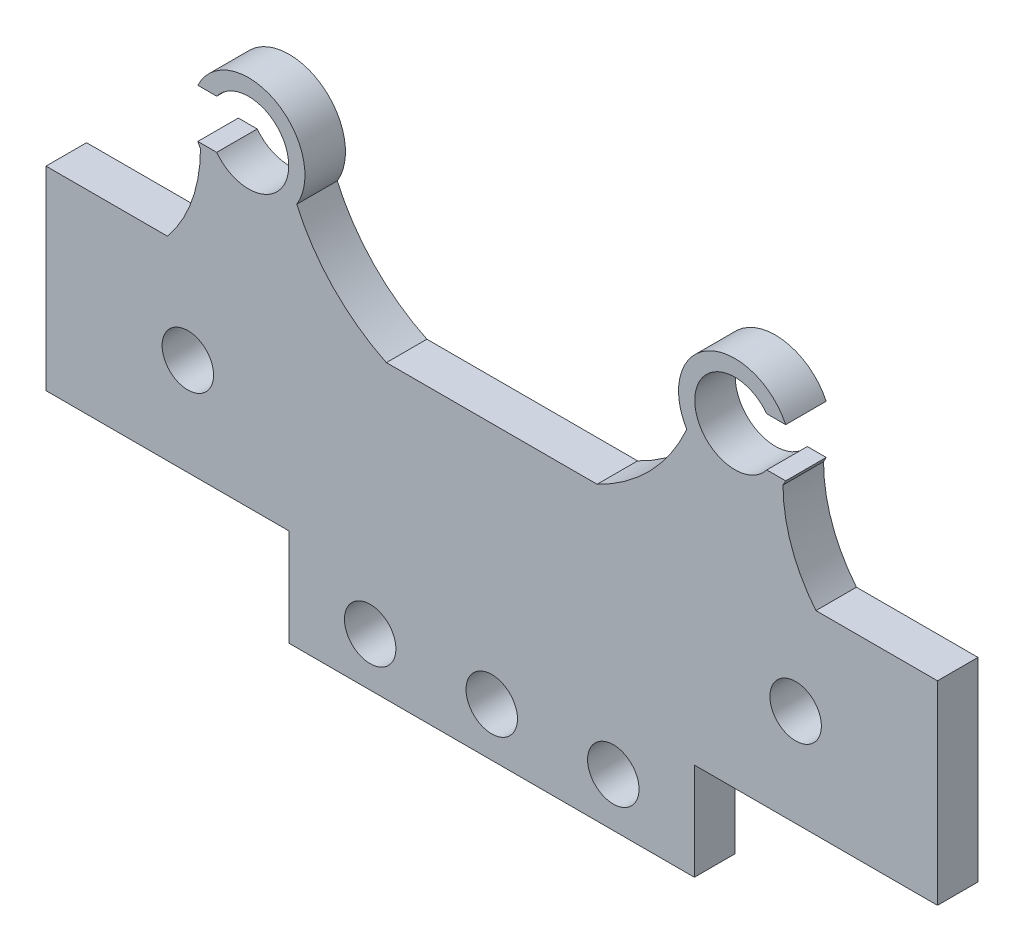
ISO-10303-21;
HEADER;
FILE_DESCRIPTION(('STEP AP214'),'2;1');
FILE_NAME('part.step','',(''),(''),'','','');
FILE_SCHEMA(('AUTOMOTIVE_DESIGN { 1 0 10303 214 1 1 1 1 }'));
ENDSEC;
DATA;
#1=APPLICATION_CONTEXT('core data for automotive mechanical design processes');
#2=APPLICATION_PROTOCOL_DEFINITION('international standard','automotive_design',2000,#1);
#3=PRODUCT_CONTEXT('',#1,'mechanical');
#4=PRODUCT('Part','Part','',(#3));
#5=PRODUCT_RELATED_PRODUCT_CATEGORY('part','',(#4));
#6=PRODUCT_DEFINITION_FORMATION('','',#4);
#7=PRODUCT_DEFINITION_CONTEXT('part definition',#1,'design');
#8=PRODUCT_DEFINITION('design','',#6,#7);
#9=PRODUCT_DEFINITION_SHAPE('','',#8);
#10=(LENGTH_UNIT() NAMED_UNIT(*) SI_UNIT(.MILLI.,.METRE.));
#11=(NAMED_UNIT(*) PLANE_ANGLE_UNIT() SI_UNIT($,.RADIAN.));
#12=(NAMED_UNIT(*) SI_UNIT($,.STERADIAN.) SOLID_ANGLE_UNIT());
#13=UNCERTAINTY_MEASURE_WITH_UNIT(LENGTH_MEASURE(1.E-05),#10,'distance_accuracy_value','');
#14=(GEOMETRIC_REPRESENTATION_CONTEXT(3) GLOBAL_UNCERTAINTY_ASSIGNED_CONTEXT((#13)) GLOBAL_UNIT_ASSIGNED_CONTEXT((#10,
#11,#12)) REPRESENTATION_CONTEXT('',''));
#15=CARTESIAN_POINT('',(0.,0.,0.));
#16=DIRECTION('',(0.,0.,1.));
#17=DIRECTION('',(1.,0.,0.));
#18=AXIS2_PLACEMENT_3D('',#15,#16,#17);
#19=CARTESIAN_POINT('',(53.9385104929325,11.3893777371026,5.));
#20=DIRECTION('',(0.,0.,1.));
#21=DIRECTION('',(1.,0.,0.));
#22=AXIS2_PLACEMENT_3D('',#19,#20,#21);
#23=PLANE('',#22);
#24=CARTESIAN_POINT('',(37.5,-12.,5.));
#25=DIRECTION('',(0.,0.,1.));
#26=DIRECTION('',(-1.,0.,0.));
#27=AXIS2_PLACEMENT_3D('',#24,#25,#26);
#28=CIRCLE('',#27,3.175);
#29=CARTESIAN_POINT('',(34.325,-12.,5.));
#30=VERTEX_POINT('',#29);
#31=EDGE_CURVE('E349',#30,#30,#28,.T.);
#32=ORIENTED_EDGE('',*,*,#31,.F.);
#33=EDGE_LOOP('',(#32));
#34=FACE_BOUND('',#33,.T.);
#35=CARTESIAN_POINT('',(-15.,-30.,5.));
#36=DIRECTION('',(0.,0.,1.));
#37=DIRECTION('',(1.,0.,0.));
#38=AXIS2_PLACEMENT_3D('',#35,#36,#37);
#39=CIRCLE('',#38,3.175);
#40=CARTESIAN_POINT('',(-11.825,-30.,5.));
#41=VERTEX_POINT('',#40);
#42=EDGE_CURVE('E333',#41,#41,#39,.T.);
#43=ORIENTED_EDGE('',*,*,#42,.F.);
#44=EDGE_LOOP('',(#43));
#45=FACE_BOUND('',#44,.T.);
#46=CARTESIAN_POINT('',(-37.5,-12.,5.));
#47=DIRECTION('',(0.,0.,1.));
#48=DIRECTION('',(1.,0.,0.));
#49=AXIS2_PLACEMENT_3D('',#46,#47,#48);
#50=CIRCLE('',#49,3.175);
#51=CARTESIAN_POINT('',(-34.325,-12.,5.));
#52=VERTEX_POINT('',#51);
#53=EDGE_CURVE('E319',#52,#52,#50,.T.);
#54=ORIENTED_EDGE('',*,*,#53,.F.);
#55=EDGE_LOOP('',(#54));
#56=FACE_BOUND('',#55,.T.);
#57=CARTESIAN_POINT('',(0.,-30.,5.));
#58=DIRECTION('',(0.,0.,1.));
#59=DIRECTION('',(1.,0.,0.));
#60=AXIS2_PLACEMENT_3D('',#57,#58,#59);
#61=CIRCLE('',#60,3.175);
#62=CARTESIAN_POINT('',(3.175,-30.,5.));
#63=VERTEX_POINT('',#62);
#64=EDGE_CURVE('E325',#63,#63,#61,.T.);
#65=ORIENTED_EDGE('',*,*,#64,.F.);
#66=EDGE_LOOP('',(#65));
#67=FACE_BOUND('',#66,.T.);
#68=CARTESIAN_POINT('',(15.,-30.,5.));
#69=DIRECTION('',(0.,0.,1.));
#70=DIRECTION('',(-1.,0.,0.));
#71=AXIS2_PLACEMENT_3D('',#68,#69,#70);
#72=CIRCLE('',#71,3.175);
#73=CARTESIAN_POINT('',(11.825,-30.,5.));
#74=VERTEX_POINT('',#73);
#75=EDGE_CURVE('E357',#74,#74,#72,.T.);
#76=ORIENTED_EDGE('',*,*,#75,.F.);
#77=EDGE_LOOP('',(#76));
#78=FACE_BOUND('',#77,.T.);
#79=CARTESIAN_POINT('',(-30.,15.,5.));
#80=DIRECTION('',(0.,0.,1.));
#81=DIRECTION('',(1.,0.,0.));
#82=AXIS2_PLACEMENT_3D('',#79,#80,#81);
#83=CIRCLE('',#82,6.95);
#84=CARTESIAN_POINT('',(-24.0614895070675,11.3893777371027,5.));
#85=VERTEX_POINT('',#84);
#86=CARTESIAN_POINT('',(-36.2691705990506,18.,5.));
#87=VERTEX_POINT('',#86);
#88=EDGE_CURVE('E221',#85,#87,#83,.T.);
#89=ORIENTED_EDGE('',*,*,#88,.T.);
#90=DIRECTION('',(-1.,0.,0.));
#91=VECTOR('',#90,1.);
#92=CARTESIAN_POINT('',(-30.,18.,5.));
#93=LINE('',#92,#91);
#94=CARTESIAN_POINT('',(-33.937321424522,18.,5.));
#95=VERTEX_POINT('',#94);
#96=EDGE_CURVE('E205',#95,#87,#93,.T.);
#97=ORIENTED_EDGE('',*,*,#96,.F.);
#98=CARTESIAN_POINT('',(-30.,15.,5.));
#99=DIRECTION('',(0.,0.,1.));
#100=DIRECTION('',(1.,0.,0.));
#101=AXIS2_PLACEMENT_3D('',#98,#99,#100);
#102=CIRCLE('',#101,4.95);
#103=CARTESIAN_POINT('',(-33.937321424522,12.,5.));
#104=VERTEX_POINT('',#103);
#105=EDGE_CURVE('E308',#104,#95,#102,.T.);
#106=ORIENTED_EDGE('',*,*,#105,.F.);
#107=DIRECTION('',(1.,0.,0.));
#108=VECTOR('',#107,1.);
#109=CARTESIAN_POINT('',(-30.,12.,5.));
#110=LINE('',#109,#108);
#111=CARTESIAN_POINT('',(-36.2691705990506,12.,5.));
#112=VERTEX_POINT('',#111);
#113=EDGE_CURVE('E69',#112,#104,#110,.T.);
#114=ORIENTED_EDGE('',*,*,#113,.F.);
#115=CARTESIAN_POINT('',(-35.9385104929326,11.3893777371026,5.));
#116=VERTEX_POINT('',#115);
#117=EDGE_CURVE('E233',#112,#116,#83,.T.);
#118=ORIENTED_EDGE('',*,*,#117,.T.);
#119=CARTESIAN_POINT('',(-53.9385104929325,11.3893777371026,5.));
#120=DIRECTION('',(0.,0.,-1.));
#121=DIRECTION('',(-1.,0.,0.));
#122=AXIS2_PLACEMENT_3D('',#119,#120,#121);
#123=CIRCLE('',#122,18.);
#124=CARTESIAN_POINT('',(-40.,0.,5.));
#125=VERTEX_POINT('',#124);
#126=EDGE_CURVE('E232',#116,#125,#123,.T.);
#127=ORIENTED_EDGE('',*,*,#126,.T.);
#128=DIRECTION('',(-1.,0.,0.));
#129=VECTOR('',#128,1.);
#130=CARTESIAN_POINT('',(-40.,0.,5.));
#131=LINE('',#130,#129);
#132=CARTESIAN_POINT('',(-55.,0.,5.));
#133=VERTEX_POINT('',#132);
#134=EDGE_CURVE('E257',#125,#133,#131,.T.);
#135=ORIENTED_EDGE('',*,*,#134,.T.);
#136=DIRECTION('',(0.,-1.,0.));
#137=VECTOR('',#136,1.);
#138=CARTESIAN_POINT('',(-55.,0.,5.));
#139=LINE('',#138,#137);
#140=CARTESIAN_POINT('',(-55.,-24.,5.));
#141=VERTEX_POINT('',#140);
#142=EDGE_CURVE('E263',#133,#141,#139,.T.);
#143=ORIENTED_EDGE('',*,*,#142,.T.);
#144=DIRECTION('',(1.,0.,0.));
#145=VECTOR('',#144,1.);
#146=CARTESIAN_POINT('',(-55.,-24.,5.));
#147=LINE('',#146,#145);
#148=CARTESIAN_POINT('',(-25.,-24.,5.));
#149=VERTEX_POINT('',#148);
#150=EDGE_CURVE('E269',#141,#149,#147,.T.);
#151=ORIENTED_EDGE('',*,*,#150,.T.);
#152=DIRECTION('',(0.,-1.,0.));
#153=VECTOR('',#152,1.);
#154=CARTESIAN_POINT('',(-25.,-24.,5.));
#155=LINE('',#154,#153);
#156=CARTESIAN_POINT('',(-25.,-36.,5.));
#157=VERTEX_POINT('',#156);
#158=EDGE_CURVE('E273',#149,#157,#155,.T.);
#159=ORIENTED_EDGE('',*,*,#158,.T.);
#160=DIRECTION('',(1.,0.,0.));
#161=VECTOR('',#160,1.);
#162=CARTESIAN_POINT('',(-25.,-36.,5.));
#163=LINE('',#162,#161);
#164=CARTESIAN_POINT('',(25.,-36.,5.));
#165=VERTEX_POINT('',#164);
#166=EDGE_CURVE('E438',#157,#165,#163,.T.);
#167=ORIENTED_EDGE('',*,*,#166,.T.);
#168=DIRECTION('',(0.,1.,0.));
#169=VECTOR('',#168,1.);
#170=CARTESIAN_POINT('',(25.,-24.,5.));
#171=LINE('',#170,#169);
#172=CARTESIAN_POINT('',(25.,-24.,5.));
#173=VERTEX_POINT('',#172);
#174=EDGE_CURVE('E442',#165,#173,#171,.T.);
#175=ORIENTED_EDGE('',*,*,#174,.T.);
#176=DIRECTION('',(1.,0.,0.));
#177=VECTOR('',#176,1.);
#178=CARTESIAN_POINT('',(55.,-24.,5.));
#179=LINE('',#178,#177);
#180=CARTESIAN_POINT('',(55.,-24.,5.));
#181=VERTEX_POINT('',#180);
#182=EDGE_CURVE('E446',#173,#181,#179,.T.);
#183=ORIENTED_EDGE('',*,*,#182,.T.);
#184=DIRECTION('',(0.,1.,0.));
#185=VECTOR('',#184,1.);
#186=CARTESIAN_POINT('',(55.,0.,5.));
#187=LINE('',#186,#185);
#188=CARTESIAN_POINT('',(55.,0.,5.));
#189=VERTEX_POINT('',#188);
#190=EDGE_CURVE('E452',#181,#189,#187,.T.);
#191=ORIENTED_EDGE('',*,*,#190,.T.);
#192=DIRECTION('',(-1.,0.,0.));
#193=VECTOR('',#192,1.);
#194=CARTESIAN_POINT('',(40.,0.,5.));
#195=LINE('',#194,#193);
#196=CARTESIAN_POINT('',(40.,0.,5.));
#197=VERTEX_POINT('',#196);
#198=EDGE_CURVE('E531',#189,#197,#195,.T.);
#199=ORIENTED_EDGE('',*,*,#198,.T.);
#200=CARTESIAN_POINT('',(53.9385104929325,11.3893777371026,5.));
#201=DIRECTION('',(0.,0.,-1.));
#202=DIRECTION('',(1.,0.,0.));
#203=AXIS2_PLACEMENT_3D('',#200,#201,#202);
#204=CIRCLE('',#203,18.);
#205=CARTESIAN_POINT('',(35.9385104929326,11.3893777371026,5.));
#206=VERTEX_POINT('',#205);
#207=EDGE_CURVE('E527',#197,#206,#204,.T.);
#208=ORIENTED_EDGE('',*,*,#207,.T.);
#209=CARTESIAN_POINT('',(30.,15.,5.));
#210=DIRECTION('',(0.,0.,1.));
#211=DIRECTION('',(-1.,0.,0.));
#212=AXIS2_PLACEMENT_3D('',#209,#210,#211);
#213=CIRCLE('',#212,6.95);
#214=CARTESIAN_POINT('',(36.2691705990506,12.,5.));
#215=VERTEX_POINT('',#214);
#216=EDGE_CURVE('E522',#206,#215,#213,.T.);
#217=ORIENTED_EDGE('',*,*,#216,.T.);
#218=DIRECTION('',(1.,0.,0.));
#219=VECTOR('',#218,1.);
#220=CARTESIAN_POINT('',(30.,12.,5.));
#221=LINE('',#220,#219);
#222=CARTESIAN_POINT('',(33.937321424522,12.,5.));
#223=VERTEX_POINT('',#222);
#224=EDGE_CURVE('E374',#223,#215,#221,.T.);
#225=ORIENTED_EDGE('',*,*,#224,.F.);
#226=CARTESIAN_POINT('',(30.,15.,5.));
#227=DIRECTION('',(0.,0.,1.));
#228=DIRECTION('',(-1.,0.,0.));
#229=AXIS2_PLACEMENT_3D('',#226,#227,#228);
#230=CIRCLE('',#229,4.95);
#231=CARTESIAN_POINT('',(33.937321424522,18.,5.));
#232=VERTEX_POINT('',#231);
#233=EDGE_CURVE('E341',#232,#223,#230,.T.);
#234=ORIENTED_EDGE('',*,*,#233,.F.);
#235=DIRECTION('',(-1.,0.,0.));
#236=VECTOR('',#235,1.);
#237=CARTESIAN_POINT('',(30.,18.,5.));
#238=LINE('',#237,#236);
#239=CARTESIAN_POINT('',(36.2691705990506,18.,5.));
#240=VERTEX_POINT('',#239);
#241=EDGE_CURVE('E379',#240,#232,#238,.T.);
#242=ORIENTED_EDGE('',*,*,#241,.F.);
#243=CARTESIAN_POINT('',(24.0614895070675,11.3893777371026,5.));
#244=VERTEX_POINT('',#243);
#245=EDGE_CURVE('E526',#240,#244,#213,.T.);
#246=ORIENTED_EDGE('',*,*,#245,.T.);
#247=CARTESIAN_POINT('',(3.04543692353487,20.7341909404895,5.));
#248=DIRECTION('',(0.,0.,-1.));
#249=DIRECTION('',(-1.,0.,0.));
#250=AXIS2_PLACEMENT_3D('',#247,#248,#249);
#251=CIRCLE('',#250,23.);
#252=CARTESIAN_POINT('',(13.,0.,5.));
#253=VERTEX_POINT('',#252);
#254=EDGE_CURVE('E518',#244,#253,#251,.T.);
#255=ORIENTED_EDGE('',*,*,#254,.T.);
#256=DIRECTION('',(-1.,0.,0.));
#257=VECTOR('',#256,1.);
#258=CARTESIAN_POINT('',(13.,0.,5.));
#259=LINE('',#258,#257);
#260=CARTESIAN_POINT('',(-13.,0.,5.));
#261=VERTEX_POINT('',#260);
#262=EDGE_CURVE('E515',#253,#261,#259,.T.);
#263=ORIENTED_EDGE('',*,*,#262,.T.);
#264=CARTESIAN_POINT('',(-3.04543692353487,20.7341909404895,5.));
#265=DIRECTION('',(0.,0.,-1.));
#266=DIRECTION('',(1.,0.,0.));
#267=AXIS2_PLACEMENT_3D('',#264,#265,#266);
#268=CIRCLE('',#267,23.);
#269=EDGE_CURVE('E229',#261,#85,#268,.T.);
#270=ORIENTED_EDGE('',*,*,#269,.T.);
#271=EDGE_LOOP('',(#89,#97,#106,#114,#118,#127,#135,#143,#151,#159,#167,#175,#183,#191,#199,
#208,#217,#225,#234,#242,#246,#255,#263,#270));
#272=FACE_BOUND('',#271,.T.);
#273=ADVANCED_FACE('F46',(#34,#45,#56,#67,#78,#272),#23,.T.);
#274=CARTESIAN_POINT('',(53.9385104929325,11.3893777371026,0.));
#275=DIRECTION('',(0.,0.,1.));
#276=DIRECTION('',(1.,0.,0.));
#277=AXIS2_PLACEMENT_3D('',#274,#275,#276);
#278=PLANE('',#277);
#279=CARTESIAN_POINT('',(-37.5,-12.,0.));
#280=DIRECTION('',(0.,0.,1.));
#281=DIRECTION('',(1.,0.,0.));
#282=AXIS2_PLACEMENT_3D('',#279,#280,#281);
#283=CIRCLE('',#282,3.175);
#284=CARTESIAN_POINT('',(-34.325,-12.,0.));
#285=VERTEX_POINT('',#284);
#286=EDGE_CURVE('E321',#285,#285,#283,.T.);
#287=ORIENTED_EDGE('',*,*,#286,.T.);
#288=EDGE_LOOP('',(#287));
#289=FACE_BOUND('',#288,.T.);
#290=CARTESIAN_POINT('',(0.,-30.,0.));
#291=DIRECTION('',(0.,0.,1.));
#292=DIRECTION('',(1.,0.,0.));
#293=AXIS2_PLACEMENT_3D('',#290,#291,#292);
#294=CIRCLE('',#293,3.175);
#295=CARTESIAN_POINT('',(3.175,-30.,0.));
#296=VERTEX_POINT('',#295);
#297=EDGE_CURVE('E329',#296,#296,#294,.T.);
#298=ORIENTED_EDGE('',*,*,#297,.T.);
#299=EDGE_LOOP('',(#298));
#300=FACE_BOUND('',#299,.T.);
#301=CARTESIAN_POINT('',(-15.,-30.,0.));
#302=DIRECTION('',(0.,0.,1.));
#303=DIRECTION('',(1.,0.,0.));
#304=AXIS2_PLACEMENT_3D('',#301,#302,#303);
#305=CIRCLE('',#304,3.175);
#306=CARTESIAN_POINT('',(-11.825,-30.,0.));
#307=VERTEX_POINT('',#306);
#308=EDGE_CURVE('E337',#307,#307,#305,.T.);
#309=ORIENTED_EDGE('',*,*,#308,.T.);
#310=EDGE_LOOP('',(#309));
#311=FACE_BOUND('',#310,.T.);
#312=CARTESIAN_POINT('',(37.5,-12.,0.));
#313=DIRECTION('',(0.,0.,1.));
#314=DIRECTION('',(-1.,0.,0.));
#315=AXIS2_PLACEMENT_3D('',#312,#313,#314);
#316=CIRCLE('',#315,3.175);
#317=CARTESIAN_POINT('',(34.325,-12.,0.));
#318=VERTEX_POINT('',#317);
#319=EDGE_CURVE('E353',#318,#318,#316,.T.);
#320=ORIENTED_EDGE('',*,*,#319,.T.);
#321=EDGE_LOOP('',(#320));
#322=FACE_BOUND('',#321,.T.);
#323=CARTESIAN_POINT('',(15.,-30.,0.));
#324=DIRECTION('',(0.,0.,1.));
#325=DIRECTION('',(-1.,0.,0.));
#326=AXIS2_PLACEMENT_3D('',#323,#324,#325);
#327=CIRCLE('',#326,3.175);
#328=CARTESIAN_POINT('',(11.825,-30.,0.));
#329=VERTEX_POINT('',#328);
#330=EDGE_CURVE('E225',#329,#329,#327,.T.);
#331=ORIENTED_EDGE('',*,*,#330,.T.);
#332=EDGE_LOOP('',(#331));
#333=FACE_BOUND('',#332,.T.);
#334=DIRECTION('',(-1.,0.,0.));
#335=VECTOR('',#334,1.);
#336=CARTESIAN_POINT('',(-30.,18.,0.));
#337=LINE('',#336,#335);
#338=CARTESIAN_POINT('',(-33.937321424522,18.,0.));
#339=VERTEX_POINT('',#338);
#340=CARTESIAN_POINT('',(-36.2691705990506,18.,0.));
#341=VERTEX_POINT('',#340);
#342=EDGE_CURVE('E62',#339,#341,#337,.T.);
#343=ORIENTED_EDGE('',*,*,#342,.T.);
#344=CARTESIAN_POINT('',(-30.,15.,0.));
#345=DIRECTION('',(0.,0.,1.));
#346=DIRECTION('',(1.,0.,0.));
#347=AXIS2_PLACEMENT_3D('',#344,#345,#346);
#348=CIRCLE('',#347,6.95);
#349=CARTESIAN_POINT('',(-24.0614895070675,11.3893777371027,0.));
#350=VERTEX_POINT('',#349);
#351=EDGE_CURVE('E223',#350,#341,#348,.T.);
#352=ORIENTED_EDGE('',*,*,#351,.F.);
#353=CARTESIAN_POINT('',(-3.04543692353487,20.7341909404895,0.));
#354=DIRECTION('',(0.,0.,-1.));
#355=DIRECTION('',(1.,0.,0.));
#356=AXIS2_PLACEMENT_3D('',#353,#354,#355);
#357=CIRCLE('',#356,23.);
#358=CARTESIAN_POINT('',(-13.,0.,0.));
#359=VERTEX_POINT('',#358);
#360=EDGE_CURVE('E690',#359,#350,#357,.T.);
#361=ORIENTED_EDGE('',*,*,#360,.F.);
#362=DIRECTION('',(-1.,0.,0.));
#363=VECTOR('',#362,1.);
#364=CARTESIAN_POINT('',(13.,0.,0.));
#365=LINE('',#364,#363);
#366=CARTESIAN_POINT('',(13.,0.,0.));
#367=VERTEX_POINT('',#366);
#368=EDGE_CURVE('E509',#367,#359,#365,.T.);
#369=ORIENTED_EDGE('',*,*,#368,.F.);
#370=CARTESIAN_POINT('',(3.04543692353487,20.7341909404895,0.));
#371=DIRECTION('',(0.,0.,-1.));
#372=DIRECTION('',(-1.,0.,0.));
#373=AXIS2_PLACEMENT_3D('',#370,#371,#372);
#374=CIRCLE('',#373,23.);
#375=CARTESIAN_POINT('',(24.0614895070675,11.3893777371026,0.));
#376=VERTEX_POINT('',#375);
#377=EDGE_CURVE('E504',#376,#367,#374,.T.);
#378=ORIENTED_EDGE('',*,*,#377,.F.);
#379=CARTESIAN_POINT('',(30.,15.,0.));
#380=DIRECTION('',(0.,0.,1.));
#381=DIRECTION('',(-1.,0.,0.));
#382=AXIS2_PLACEMENT_3D('',#379,#380,#381);
#383=CIRCLE('',#382,6.95);
#384=CARTESIAN_POINT('',(36.2691705990506,18.,0.));
#385=VERTEX_POINT('',#384);
#386=EDGE_CURVE('E505',#385,#376,#383,.T.);
#387=ORIENTED_EDGE('',*,*,#386,.F.);
#388=DIRECTION('',(-1.,0.,0.));
#389=VECTOR('',#388,1.);
#390=CARTESIAN_POINT('',(30.,18.,0.));
#391=LINE('',#390,#389);
#392=CARTESIAN_POINT('',(33.937321424522,18.,0.));
#393=VERTEX_POINT('',#392);
#394=EDGE_CURVE('E380',#385,#393,#391,.T.);
#395=ORIENTED_EDGE('',*,*,#394,.T.);
#396=CARTESIAN_POINT('',(30.,15.,0.));
#397=DIRECTION('',(0.,0.,1.));
#398=DIRECTION('',(-1.,0.,0.));
#399=AXIS2_PLACEMENT_3D('',#396,#397,#398);
#400=CIRCLE('',#399,4.95);
#401=CARTESIAN_POINT('',(33.937321424522,12.,0.));
#402=VERTEX_POINT('',#401);
#403=EDGE_CURVE('E345',#393,#402,#400,.T.);
#404=ORIENTED_EDGE('',*,*,#403,.T.);
#405=DIRECTION('',(1.,0.,0.));
#406=VECTOR('',#405,1.);
#407=CARTESIAN_POINT('',(30.,12.,0.));
#408=LINE('',#407,#406);
#409=CARTESIAN_POINT('',(36.2691705990506,12.,0.));
#410=VERTEX_POINT('',#409);
#411=EDGE_CURVE('E375',#402,#410,#408,.T.);
#412=ORIENTED_EDGE('',*,*,#411,.T.);
#413=CARTESIAN_POINT('',(35.9385104929326,11.3893777371026,0.));
#414=VERTEX_POINT('',#413);
#415=EDGE_CURVE('E499',#414,#410,#383,.T.);
#416=ORIENTED_EDGE('',*,*,#415,.F.);
#417=CARTESIAN_POINT('',(53.9385104929325,11.3893777371026,0.));
#418=DIRECTION('',(0.,0.,-1.));
#419=DIRECTION('',(1.,0.,0.));
#420=AXIS2_PLACEMENT_3D('',#417,#418,#419);
#421=CIRCLE('',#420,18.);
#422=CARTESIAN_POINT('',(40.,0.,0.));
#423=VERTEX_POINT('',#422);
#424=EDGE_CURVE('E489',#423,#414,#421,.T.);
#425=ORIENTED_EDGE('',*,*,#424,.F.);
#426=DIRECTION('',(-1.,0.,0.));
#427=VECTOR('',#426,1.);
#428=CARTESIAN_POINT('',(40.,0.,0.));
#429=LINE('',#428,#427);
#430=CARTESIAN_POINT('',(55.,0.,0.));
#431=VERTEX_POINT('',#430);
#432=EDGE_CURVE('E485',#431,#423,#429,.T.);
#433=ORIENTED_EDGE('',*,*,#432,.F.);
#434=DIRECTION('',(0.,1.,0.));
#435=VECTOR('',#434,1.);
#436=CARTESIAN_POINT('',(55.,0.,0.));
#437=LINE('',#436,#435);
#438=CARTESIAN_POINT('',(55.,-24.,0.));
#439=VERTEX_POINT('',#438);
#440=EDGE_CURVE('E479',#439,#431,#437,.T.);
#441=ORIENTED_EDGE('',*,*,#440,.F.);
#442=DIRECTION('',(1.,0.,0.));
#443=VECTOR('',#442,1.);
#444=CARTESIAN_POINT('',(55.,-24.,0.));
#445=LINE('',#444,#443);
#446=CARTESIAN_POINT('',(25.,-24.,0.));
#447=VERTEX_POINT('',#446);
#448=EDGE_CURVE('E475',#447,#439,#445,.T.);
#449=ORIENTED_EDGE('',*,*,#448,.F.);
#450=DIRECTION('',(0.,1.,0.));
#451=VECTOR('',#450,1.);
#452=CARTESIAN_POINT('',(25.,-24.,0.));
#453=LINE('',#452,#451);
#454=CARTESIAN_POINT('',(25.,-36.,0.));
#455=VERTEX_POINT('',#454);
#456=EDGE_CURVE('E480',#455,#447,#453,.T.);
#457=ORIENTED_EDGE('',*,*,#456,.F.);
#458=DIRECTION('',(1.,0.,0.));
#459=VECTOR('',#458,1.);
#460=CARTESIAN_POINT('',(-25.,-36.,0.));
#461=LINE('',#460,#459);
#462=CARTESIAN_POINT('',(-25.,-36.,0.));
#463=VERTEX_POINT('',#462);
#464=EDGE_CURVE('E970',#463,#455,#461,.T.);
#465=ORIENTED_EDGE('',*,*,#464,.F.);
#466=DIRECTION('',(0.,-1.,0.));
#467=VECTOR('',#466,1.);
#468=CARTESIAN_POINT('',(-25.,-24.,0.));
#469=LINE('',#468,#467);
#470=CARTESIAN_POINT('',(-25.,-24.,0.));
#471=VERTEX_POINT('',#470);
#472=EDGE_CURVE('E971',#471,#463,#469,.T.);
#473=ORIENTED_EDGE('',*,*,#472,.F.);
#474=DIRECTION('',(1.,0.,0.));
#475=VECTOR('',#474,1.);
#476=CARTESIAN_POINT('',(-55.,-24.,0.));
#477=LINE('',#476,#475);
#478=CARTESIAN_POINT('',(-55.,-24.,0.));
#479=VERTEX_POINT('',#478);
#480=EDGE_CURVE('E429',#479,#471,#477,.T.);
#481=ORIENTED_EDGE('',*,*,#480,.F.);
#482=DIRECTION('',(0.,-1.,0.));
#483=VECTOR('',#482,1.);
#484=CARTESIAN_POINT('',(-55.,0.,0.));
#485=LINE('',#484,#483);
#486=CARTESIAN_POINT('',(-55.,0.,0.));
#487=VERTEX_POINT('',#486);
#488=EDGE_CURVE('E318',#487,#479,#485,.T.);
#489=ORIENTED_EDGE('',*,*,#488,.F.);
#490=DIRECTION('',(-1.,0.,0.));
#491=VECTOR('',#490,1.);
#492=CARTESIAN_POINT('',(-40.,0.,0.));
#493=LINE('',#492,#491);
#494=CARTESIAN_POINT('',(-40.,0.,0.));
#495=VERTEX_POINT('',#494);
#496=EDGE_CURVE('E313',#495,#487,#493,.T.);
#497=ORIENTED_EDGE('',*,*,#496,.F.);
#498=CARTESIAN_POINT('',(-53.9385104929325,11.3893777371026,0.));
#499=DIRECTION('',(0.,0.,-1.));
#500=DIRECTION('',(-1.,0.,0.));
#501=AXIS2_PLACEMENT_3D('',#498,#499,#500);
#502=CIRCLE('',#501,18.);
#503=CARTESIAN_POINT('',(-35.9385104929326,11.3893777371026,0.));
#504=VERTEX_POINT('',#503);
#505=EDGE_CURVE('E264',#504,#495,#502,.T.);
#506=ORIENTED_EDGE('',*,*,#505,.F.);
#507=CARTESIAN_POINT('',(-36.2691705990506,12.,0.));
#508=VERTEX_POINT('',#507);
#509=EDGE_CURVE('E401',#508,#504,#348,.T.);
#510=ORIENTED_EDGE('',*,*,#509,.F.);
#511=DIRECTION('',(1.,0.,0.));
#512=VECTOR('',#511,1.);
#513=CARTESIAN_POINT('',(-30.,12.,0.));
#514=LINE('',#513,#512);
#515=CARTESIAN_POINT('',(-33.937321424522,12.,0.));
#516=VERTEX_POINT('',#515);
#517=EDGE_CURVE('E214',#508,#516,#514,.T.);
#518=ORIENTED_EDGE('',*,*,#517,.T.);
#519=CARTESIAN_POINT('',(-30.,15.,0.));
#520=DIRECTION('',(0.,0.,1.));
#521=DIRECTION('',(1.,0.,0.));
#522=AXIS2_PLACEMENT_3D('',#519,#520,#521);
#523=CIRCLE('',#522,4.95);
#524=EDGE_CURVE('E265',#516,#339,#523,.T.);
#525=ORIENTED_EDGE('',*,*,#524,.T.);
#526=EDGE_LOOP('',(#343,#352,#361,#369,#378,#387,#395,#404,#412,#416,#425,#433,#441,#449,#457,
#465,#473,#481,#489,#497,#506,#510,#518,#525));
#527=FACE_BOUND('',#526,.T.);
#528=ADVANCED_FACE('F397',(#289,#300,#311,#322,#333,#527),#278,.F.);
#529=CARTESIAN_POINT('',(30.,15.,5.));
#530=DIRECTION('',(0.,0.,-1.));
#531=DIRECTION('',(-1.,0.,0.));
#532=AXIS2_PLACEMENT_3D('',#529,#530,#531);
#533=CYLINDRICAL_SURFACE('',#532,6.95);
#534=DIRECTION('',(0.,0.,-1.));
#535=VECTOR('',#534,1.);
#536=CARTESIAN_POINT('',(36.2691705990506,18.,5.));
#537=LINE('',#536,#535);
#538=EDGE_CURVE('E370',#240,#385,#537,.T.);
#539=ORIENTED_EDGE('',*,*,#538,.T.);
#540=ORIENTED_EDGE('',*,*,#386,.T.);
#541=DIRECTION('',(0.,0.,-1.));
#542=VECTOR('',#541,1.);
#543=CARTESIAN_POINT('',(24.0614895070675,11.3893777371026,5.));
#544=LINE('',#543,#542);
#545=EDGE_CURVE('E583',#244,#376,#544,.T.);
#546=ORIENTED_EDGE('',*,*,#545,.F.);
#547=ORIENTED_EDGE('',*,*,#245,.F.);
#548=EDGE_LOOP('',(#539,#540,#546,#547));
#549=FACE_BOUND('',#548,.T.);
#550=ADVANCED_FACE('F581',(#549),#533,.T.);
#551=DIRECTION('',(0.,0.,-1.));
#552=VECTOR('',#551,1.);
#553=CARTESIAN_POINT('',(36.2691705990506,12.,5.));
#554=LINE('',#553,#552);
#555=EDGE_CURVE('E367',#215,#410,#554,.T.);
#556=ORIENTED_EDGE('',*,*,#555,.F.);
#557=ORIENTED_EDGE('',*,*,#216,.F.);
#558=DIRECTION('',(0.,0.,-1.));
#559=VECTOR('',#558,1.);
#560=CARTESIAN_POINT('',(35.9385104929326,11.3893777371026,5.));
#561=LINE('',#560,#559);
#562=EDGE_CURVE('E558',#206,#414,#561,.T.);
#563=ORIENTED_EDGE('',*,*,#562,.T.);
#564=ORIENTED_EDGE('',*,*,#415,.T.);
#565=EDGE_LOOP('',(#556,#557,#563,#564));
#566=FACE_BOUND('',#565,.T.);
#567=ADVANCED_FACE('F568',(#566),#533,.T.);
#568=CARTESIAN_POINT('',(-30.,15.,5.));
#569=DIRECTION('',(0.,0.,-1.));
#570=DIRECTION('',(-1.,0.,0.));
#571=AXIS2_PLACEMENT_3D('',#568,#569,#570);
#572=CYLINDRICAL_SURFACE('',#571,6.95);
#573=DIRECTION('',(0.,0.,-1.));
#574=VECTOR('',#573,1.);
#575=CARTESIAN_POINT('',(-36.2691705990506,18.,5.));
#576=LINE('',#575,#574);
#577=EDGE_CURVE('E208',#87,#341,#576,.T.);
#578=ORIENTED_EDGE('',*,*,#577,.F.);
#579=ORIENTED_EDGE('',*,*,#88,.F.);
#580=DIRECTION('',(0.,0.,-1.));
#581=VECTOR('',#580,1.);
#582=CARTESIAN_POINT('',(-24.0614895070675,11.3893777371027,5.));
#583=LINE('',#582,#581);
#584=EDGE_CURVE('E602',#85,#350,#583,.T.);
#585=ORIENTED_EDGE('',*,*,#584,.T.);
#586=ORIENTED_EDGE('',*,*,#351,.T.);
#587=EDGE_LOOP('',(#578,#579,#585,#586));
#588=FACE_BOUND('',#587,.T.);
#589=ADVANCED_FACE('F219',(#588),#572,.T.);
#590=DIRECTION('',(0.,0.,-1.));
#591=VECTOR('',#590,1.);
#592=CARTESIAN_POINT('',(-36.2691705990506,12.,5.));
#593=LINE('',#592,#591);
#594=EDGE_CURVE('E226',#112,#508,#593,.T.);
#595=ORIENTED_EDGE('',*,*,#594,.T.);
#596=ORIENTED_EDGE('',*,*,#509,.T.);
#597=DIRECTION('',(0.,0.,-1.));
#598=VECTOR('',#597,1.);
#599=CARTESIAN_POINT('',(-35.9385104929326,11.3893777371026,5.));
#600=LINE('',#599,#598);
#601=EDGE_CURVE('E407',#116,#504,#600,.T.);
#602=ORIENTED_EDGE('',*,*,#601,.F.);
#603=ORIENTED_EDGE('',*,*,#117,.F.);
#604=EDGE_LOOP('',(#595,#596,#602,#603));
#605=FACE_BOUND('',#604,.T.);
#606=ADVANCED_FACE('F404',(#605),#572,.T.);
#607=CARTESIAN_POINT('',(-30.,15.,5.));
#608=DIRECTION('',(0.,0.,-1.));
#609=DIRECTION('',(-1.,0.,0.));
#610=AXIS2_PLACEMENT_3D('',#607,#608,#609);
#611=CYLINDRICAL_SURFACE('',#610,4.95);
#612=ORIENTED_EDGE('',*,*,#105,.T.);
#613=DIRECTION('',(0.,0.,-1.));
#614=VECTOR('',#613,1.);
#615=CARTESIAN_POINT('',(-33.937321424522,18.,5.));
#616=LINE('',#615,#614);
#617=EDGE_CURVE('E12',#95,#339,#616,.T.);
#618=ORIENTED_EDGE('',*,*,#617,.T.);
#619=ORIENTED_EDGE('',*,*,#524,.F.);
#620=DIRECTION('',(0.,0.,-1.));
#621=VECTOR('',#620,1.);
#622=CARTESIAN_POINT('',(-33.937321424522,12.,5.));
#623=LINE('',#622,#621);
#624=EDGE_CURVE('E55',#516,#104,#623,.F.);
#625=ORIENTED_EDGE('',*,*,#624,.T.);
#626=EDGE_LOOP('',(#612,#618,#619,#625));
#627=FACE_BOUND('',#626,.T.);
#628=ADVANCED_FACE('F307',(#627),#611,.F.);
#629=CARTESIAN_POINT('',(30.,15.,5.));
#630=DIRECTION('',(0.,0.,-1.));
#631=DIRECTION('',(-1.,0.,0.));
#632=AXIS2_PLACEMENT_3D('',#629,#630,#631);
#633=CYLINDRICAL_SURFACE('',#632,4.95);
#634=ORIENTED_EDGE('',*,*,#403,.F.);
#635=DIRECTION('',(0.,0.,-1.));
#636=VECTOR('',#635,1.);
#637=CARTESIAN_POINT('',(33.937321424522,18.,5.));
#638=LINE('',#637,#636);
#639=EDGE_CURVE('E301',#393,#232,#638,.F.);
#640=ORIENTED_EDGE('',*,*,#639,.T.);
#641=ORIENTED_EDGE('',*,*,#233,.T.);
#642=DIRECTION('',(0.,0.,-1.));
#643=VECTOR('',#642,1.);
#644=CARTESIAN_POINT('',(33.937321424522,12.,5.));
#645=LINE('',#644,#643);
#646=EDGE_CURVE('E297',#223,#402,#645,.T.);
#647=ORIENTED_EDGE('',*,*,#646,.T.);
#648=EDGE_LOOP('',(#634,#640,#641,#647));
#649=FACE_BOUND('',#648,.T.);
#650=ADVANCED_FACE('F575',(#649),#633,.F.);
#651=CARTESIAN_POINT('',(-40.,0.,5.));
#652=DIRECTION('',(0.,-1.,0.));
#653=DIRECTION('',(1.,0.,0.));
#654=AXIS2_PLACEMENT_3D('',#651,#652,#653);
#655=PLANE('',#654);
#656=ORIENTED_EDGE('',*,*,#496,.T.);
#657=DIRECTION('',(0.,0.,-1.));
#658=VECTOR('',#657,1.);
#659=CARTESIAN_POINT('',(-55.,0.,5.));
#660=LINE('',#659,#658);
#661=EDGE_CURVE('E290',#133,#487,#660,.T.);
#662=ORIENTED_EDGE('',*,*,#661,.F.);
#663=ORIENTED_EDGE('',*,*,#134,.F.);
#664=DIRECTION('',(0.,0.,-1.));
#665=VECTOR('',#664,1.);
#666=CARTESIAN_POINT('',(-40.,0.,5.));
#667=LINE('',#666,#665);
#668=EDGE_CURVE('E238',#125,#495,#667,.T.);
#669=ORIENTED_EDGE('',*,*,#668,.T.);
#670=EDGE_LOOP('',(#656,#662,#663,#669));
#671=FACE_BOUND('',#670,.T.);
#672=ADVANCED_FACE('F48',(#671),#655,.F.);
#673=CARTESIAN_POINT('',(-55.,0.,5.));
#674=DIRECTION('',(1.,0.,0.));
#675=DIRECTION('',(0.,0.,-1.));
#676=AXIS2_PLACEMENT_3D('',#673,#674,#675);
#677=PLANE('',#676);
#678=ORIENTED_EDGE('',*,*,#488,.T.);
#679=DIRECTION('',(0.,0.,-1.));
#680=VECTOR('',#679,1.);
#681=CARTESIAN_POINT('',(-55.,-24.,5.));
#682=LINE('',#681,#680);
#683=EDGE_CURVE('E285',#141,#479,#682,.T.);
#684=ORIENTED_EDGE('',*,*,#683,.F.);
#685=ORIENTED_EDGE('',*,*,#142,.F.);
#686=ORIENTED_EDGE('',*,*,#661,.T.);
#687=EDGE_LOOP('',(#678,#684,#685,#686));
#688=FACE_BOUND('',#687,.T.);
#689=ADVANCED_FACE('F419',(#688),#677,.F.);
#690=CARTESIAN_POINT('',(-55.,-24.,5.));
#691=DIRECTION('',(0.,1.,0.));
#692=DIRECTION('',(0.,0.,1.));
#693=AXIS2_PLACEMENT_3D('',#690,#691,#692);
#694=PLANE('',#693);
#695=ORIENTED_EDGE('',*,*,#480,.T.);
#696=DIRECTION('',(0.,0.,-1.));
#697=VECTOR('',#696,1.);
#698=CARTESIAN_POINT('',(-25.,-24.,5.));
#699=LINE('',#698,#697);
#700=EDGE_CURVE('E291',#149,#471,#699,.T.);
#701=ORIENTED_EDGE('',*,*,#700,.F.);
#702=ORIENTED_EDGE('',*,*,#150,.F.);
#703=ORIENTED_EDGE('',*,*,#683,.T.);
#704=EDGE_LOOP('',(#695,#701,#702,#703));
#705=FACE_BOUND('',#704,.T.);
#706=ADVANCED_FACE('F427',(#705),#694,.F.);
#707=CARTESIAN_POINT('',(-25.,-24.,5.));
#708=DIRECTION('',(1.,0.,0.));
#709=DIRECTION('',(0.,0.,-1.));
#710=AXIS2_PLACEMENT_3D('',#707,#708,#709);
#711=PLANE('',#710);
#712=ORIENTED_EDGE('',*,*,#472,.T.);
#713=DIRECTION('',(0.,0.,-1.));
#714=VECTOR('',#713,1.);
#715=CARTESIAN_POINT('',(-25.,-36.,5.));
#716=LINE('',#715,#714);
#717=EDGE_CURVE('E433',#157,#463,#716,.T.);
#718=ORIENTED_EDGE('',*,*,#717,.F.);
#719=ORIENTED_EDGE('',*,*,#158,.F.);
#720=ORIENTED_EDGE('',*,*,#700,.T.);
#721=EDGE_LOOP('',(#712,#718,#719,#720));
#722=FACE_BOUND('',#721,.T.);
#723=ADVANCED_FACE('F434',(#722),#711,.F.);
#724=CARTESIAN_POINT('',(-25.,-36.,5.));
#725=DIRECTION('',(0.,1.,0.));
#726=DIRECTION('',(0.,0.,1.));
#727=AXIS2_PLACEMENT_3D('',#724,#725,#726);
#728=PLANE('',#727);
#729=ORIENTED_EDGE('',*,*,#464,.T.);
#730=DIRECTION('',(0.,0.,-1.));
#731=VECTOR('',#730,1.);
#732=CARTESIAN_POINT('',(25.,-36.,5.));
#733=LINE('',#732,#731);
#734=EDGE_CURVE('E466',#165,#455,#733,.T.);
#735=ORIENTED_EDGE('',*,*,#734,.F.);
#736=ORIENTED_EDGE('',*,*,#166,.F.);
#737=ORIENTED_EDGE('',*,*,#717,.T.);
#738=EDGE_LOOP('',(#729,#735,#736,#737));
#739=FACE_BOUND('',#738,.T.);
#740=ADVANCED_FACE('F624',(#739),#728,.F.);
#741=CARTESIAN_POINT('',(25.,-24.,5.));
#742=DIRECTION('',(-1.,0.,0.));
#743=DIRECTION('',(0.,0.,1.));
#744=AXIS2_PLACEMENT_3D('',#741,#742,#743);
#745=PLANE('',#744);
#746=ORIENTED_EDGE('',*,*,#456,.T.);
#747=DIRECTION('',(0.,0.,-1.));
#748=VECTOR('',#747,1.);
#749=CARTESIAN_POINT('',(25.,-24.,5.));
#750=LINE('',#749,#748);
#751=EDGE_CURVE('E461',#173,#447,#750,.T.);
#752=ORIENTED_EDGE('',*,*,#751,.F.);
#753=ORIENTED_EDGE('',*,*,#174,.F.);
#754=ORIENTED_EDGE('',*,*,#734,.T.);
#755=EDGE_LOOP('',(#746,#752,#753,#754));
#756=FACE_BOUND('',#755,.T.);
#757=ADVANCED_FACE('F643',(#756),#745,.F.);
#758=CARTESIAN_POINT('',(55.,-24.,5.));
#759=DIRECTION('',(0.,1.,0.));
#760=DIRECTION('',(0.,0.,1.));
#761=AXIS2_PLACEMENT_3D('',#758,#759,#760);
#762=PLANE('',#761);
#763=ORIENTED_EDGE('',*,*,#448,.T.);
#764=DIRECTION('',(0.,0.,-1.));
#765=VECTOR('',#764,1.);
#766=CARTESIAN_POINT('',(55.,-24.,5.));
#767=LINE('',#766,#765);
#768=EDGE_CURVE('E467',#181,#439,#767,.T.);
#769=ORIENTED_EDGE('',*,*,#768,.F.);
#770=ORIENTED_EDGE('',*,*,#182,.F.);
#771=ORIENTED_EDGE('',*,*,#751,.T.);
#772=EDGE_LOOP('',(#763,#769,#770,#771));
#773=FACE_BOUND('',#772,.T.);
#774=ADVANCED_FACE('F660',(#773),#762,.F.);
#775=CARTESIAN_POINT('',(55.,0.,5.));
#776=DIRECTION('',(-1.,0.,0.));
#777=DIRECTION('',(0.,0.,1.));
#778=AXIS2_PLACEMENT_3D('',#775,#776,#777);
#779=PLANE('',#778);
#780=ORIENTED_EDGE('',*,*,#440,.T.);
#781=DIRECTION('',(0.,0.,-1.));
#782=VECTOR('',#781,1.);
#783=CARTESIAN_POINT('',(55.,0.,5.));
#784=LINE('',#783,#782);
#785=EDGE_CURVE('E545',#189,#431,#784,.T.);
#786=ORIENTED_EDGE('',*,*,#785,.F.);
#787=ORIENTED_EDGE('',*,*,#190,.F.);
#788=ORIENTED_EDGE('',*,*,#768,.T.);
#789=EDGE_LOOP('',(#780,#786,#787,#788));
#790=FACE_BOUND('',#789,.T.);
#791=ADVANCED_FACE('F546',(#790),#779,.F.);
#792=CARTESIAN_POINT('',(40.,0.,5.));
#793=DIRECTION('',(0.,-1.,0.));
#794=DIRECTION('',(1.,0.,0.));
#795=AXIS2_PLACEMENT_3D('',#792,#793,#794);
#796=PLANE('',#795);
#797=ORIENTED_EDGE('',*,*,#432,.T.);
#798=DIRECTION('',(0.,0.,-1.));
#799=VECTOR('',#798,1.);
#800=CARTESIAN_POINT('',(40.,0.,5.));
#801=LINE('',#800,#799);
#802=EDGE_CURVE('E551',#197,#423,#801,.T.);
#803=ORIENTED_EDGE('',*,*,#802,.F.);
#804=ORIENTED_EDGE('',*,*,#198,.F.);
#805=ORIENTED_EDGE('',*,*,#785,.T.);
#806=EDGE_LOOP('',(#797,#803,#804,#805));
#807=FACE_BOUND('',#806,.T.);
#808=ADVANCED_FACE('F552',(#807),#796,.F.);
#809=CARTESIAN_POINT('',(53.9385104929325,11.3893777371026,5.));
#810=DIRECTION('',(0.,0.,-1.));
#811=DIRECTION('',(-1.,0.,0.));
#812=AXIS2_PLACEMENT_3D('',#809,#810,#811);
#813=CYLINDRICAL_SURFACE('',#812,18.);
#814=ORIENTED_EDGE('',*,*,#424,.T.);
#815=ORIENTED_EDGE('',*,*,#562,.F.);
#816=ORIENTED_EDGE('',*,*,#207,.F.);
#817=ORIENTED_EDGE('',*,*,#802,.T.);
#818=EDGE_LOOP('',(#814,#815,#816,#817));
#819=FACE_BOUND('',#818,.T.);
#820=ADVANCED_FACE('F561',(#819),#813,.F.);
#821=CARTESIAN_POINT('',(3.04543692353487,20.7341909404895,5.));
#822=DIRECTION('',(0.,0.,-1.));
#823=DIRECTION('',(-1.,0.,0.));
#824=AXIS2_PLACEMENT_3D('',#821,#822,#823);
#825=CYLINDRICAL_SURFACE('',#824,23.);
#826=ORIENTED_EDGE('',*,*,#377,.T.);
#827=DIRECTION('',(0.,0.,-1.));
#828=VECTOR('',#827,1.);
#829=CARTESIAN_POINT('',(13.,0.,5.));
#830=LINE('',#829,#828);
#831=EDGE_CURVE('E588',#253,#367,#830,.T.);
#832=ORIENTED_EDGE('',*,*,#831,.F.);
#833=ORIENTED_EDGE('',*,*,#254,.F.);
#834=ORIENTED_EDGE('',*,*,#545,.T.);
#835=EDGE_LOOP('',(#826,#832,#833,#834));
#836=FACE_BOUND('',#835,.T.);
#837=ADVANCED_FACE('F591',(#836),#825,.F.);
#838=CARTESIAN_POINT('',(13.,0.,5.));
#839=DIRECTION('',(0.,-1.,0.));
#840=DIRECTION('',(0.,0.,-1.));
#841=AXIS2_PLACEMENT_3D('',#838,#839,#840);
#842=PLANE('',#841);
#843=ORIENTED_EDGE('',*,*,#368,.T.);
#844=DIRECTION('',(0.,0.,-1.));
#845=VECTOR('',#844,1.);
#846=CARTESIAN_POINT('',(-13.,0.,5.));
#847=LINE('',#846,#845);
#848=EDGE_CURVE('E597',#261,#359,#847,.T.);
#849=ORIENTED_EDGE('',*,*,#848,.F.);
#850=ORIENTED_EDGE('',*,*,#262,.F.);
#851=ORIENTED_EDGE('',*,*,#831,.T.);
#852=EDGE_LOOP('',(#843,#849,#850,#851));
#853=FACE_BOUND('',#852,.T.);
#854=ADVANCED_FACE('F598',(#853),#842,.F.);
#855=CARTESIAN_POINT('',(-3.04543692353487,20.7341909404895,5.));
#856=DIRECTION('',(0.,0.,-1.));
#857=DIRECTION('',(-1.,0.,0.));
#858=AXIS2_PLACEMENT_3D('',#855,#856,#857);
#859=CYLINDRICAL_SURFACE('',#858,23.);
#860=ORIENTED_EDGE('',*,*,#360,.T.);
#861=ORIENTED_EDGE('',*,*,#584,.F.);
#862=ORIENTED_EDGE('',*,*,#269,.F.);
#863=ORIENTED_EDGE('',*,*,#848,.T.);
#864=EDGE_LOOP('',(#860,#861,#862,#863));
#865=FACE_BOUND('',#864,.T.);
#866=ADVANCED_FACE('F604',(#865),#859,.F.);
#867=CARTESIAN_POINT('',(-53.9385104929325,11.3893777371026,5.));
#868=DIRECTION('',(0.,0.,-1.));
#869=DIRECTION('',(-1.,0.,0.));
#870=AXIS2_PLACEMENT_3D('',#867,#868,#869);
#871=CYLINDRICAL_SURFACE('',#870,18.);
#872=ORIENTED_EDGE('',*,*,#505,.T.);
#873=ORIENTED_EDGE('',*,*,#668,.F.);
#874=ORIENTED_EDGE('',*,*,#126,.F.);
#875=ORIENTED_EDGE('',*,*,#601,.T.);
#876=EDGE_LOOP('',(#872,#873,#874,#875));
#877=FACE_BOUND('',#876,.T.);
#878=ADVANCED_FACE('F414',(#877),#871,.F.);
#879=CARTESIAN_POINT('',(-37.5,-12.,5.));
#880=DIRECTION('',(0.,0.,-1.));
#881=DIRECTION('',(-1.,0.,0.));
#882=AXIS2_PLACEMENT_3D('',#879,#880,#881);
#883=CYLINDRICAL_SURFACE('',#882,3.175);
#884=ORIENTED_EDGE('',*,*,#53,.T.);
#885=EDGE_LOOP('',(#884));
#886=FACE_BOUND('',#885,.T.);
#887=ORIENTED_EDGE('',*,*,#286,.F.);
#888=EDGE_LOOP('',(#887));
#889=FACE_BOUND('',#888,.T.);
#890=ADVANCED_FACE('F817',(#886,#889),#883,.F.);
#891=CARTESIAN_POINT('',(0.,-30.,5.));
#892=DIRECTION('',(0.,0.,-1.));
#893=DIRECTION('',(-1.,0.,0.));
#894=AXIS2_PLACEMENT_3D('',#891,#892,#893);
#895=CYLINDRICAL_SURFACE('',#894,3.175);
#896=ORIENTED_EDGE('',*,*,#64,.T.);
#897=EDGE_LOOP('',(#896));
#898=FACE_BOUND('',#897,.T.);
#899=ORIENTED_EDGE('',*,*,#297,.F.);
#900=EDGE_LOOP('',(#899));
#901=FACE_BOUND('',#900,.T.);
#902=ADVANCED_FACE('F807',(#898,#901),#895,.F.);
#903=CARTESIAN_POINT('',(-15.,-30.,5.));
#904=DIRECTION('',(0.,0.,-1.));
#905=DIRECTION('',(-1.,0.,0.));
#906=AXIS2_PLACEMENT_3D('',#903,#904,#905);
#907=CYLINDRICAL_SURFACE('',#906,3.175);
#908=ORIENTED_EDGE('',*,*,#42,.T.);
#909=EDGE_LOOP('',(#908));
#910=FACE_BOUND('',#909,.T.);
#911=ORIENTED_EDGE('',*,*,#308,.F.);
#912=EDGE_LOOP('',(#911));
#913=FACE_BOUND('',#912,.T.);
#914=ADVANCED_FACE('F798',(#910,#913),#907,.F.);
#915=CARTESIAN_POINT('',(37.5,-12.,5.));
#916=DIRECTION('',(0.,0.,-1.));
#917=DIRECTION('',(-1.,0.,0.));
#918=AXIS2_PLACEMENT_3D('',#915,#916,#917);
#919=CYLINDRICAL_SURFACE('',#918,3.175);
#920=ORIENTED_EDGE('',*,*,#31,.T.);
#921=EDGE_LOOP('',(#920));
#922=FACE_BOUND('',#921,.T.);
#923=ORIENTED_EDGE('',*,*,#319,.F.);
#924=EDGE_LOOP('',(#923));
#925=FACE_BOUND('',#924,.T.);
#926=ADVANCED_FACE('F791',(#922,#925),#919,.F.);
#927=CARTESIAN_POINT('',(15.,-30.,5.));
#928=DIRECTION('',(0.,0.,-1.));
#929=DIRECTION('',(-1.,0.,0.));
#930=AXIS2_PLACEMENT_3D('',#927,#928,#929);
#931=CYLINDRICAL_SURFACE('',#930,3.175);
#932=ORIENTED_EDGE('',*,*,#75,.T.);
#933=EDGE_LOOP('',(#932));
#934=FACE_BOUND('',#933,.T.);
#935=ORIENTED_EDGE('',*,*,#330,.F.);
#936=EDGE_LOOP('',(#935));
#937=FACE_BOUND('',#936,.T.);
#938=ADVANCED_FACE('F765',(#934,#937),#931,.F.);
#939=CARTESIAN_POINT('',(30.,12.,5.));
#940=DIRECTION('',(0.,1.,0.));
#941=DIRECTION('',(-1.,0.,0.));
#942=AXIS2_PLACEMENT_3D('',#939,#940,#941);
#943=PLANE('',#942);
#944=ORIENTED_EDGE('',*,*,#224,.T.);
#945=ORIENTED_EDGE('',*,*,#555,.T.);
#946=ORIENTED_EDGE('',*,*,#411,.F.);
#947=ORIENTED_EDGE('',*,*,#646,.F.);
#948=EDGE_LOOP('',(#944,#945,#946,#947));
#949=FACE_BOUND('',#948,.T.);
#950=ADVANCED_FACE('F571',(#949),#943,.T.);
#951=CARTESIAN_POINT('',(30.,18.,5.));
#952=DIRECTION('',(0.,-1.,0.));
#953=DIRECTION('',(1.,0.,0.));
#954=AXIS2_PLACEMENT_3D('',#951,#952,#953);
#955=PLANE('',#954);
#956=ORIENTED_EDGE('',*,*,#394,.F.);
#957=ORIENTED_EDGE('',*,*,#538,.F.);
#958=ORIENTED_EDGE('',*,*,#241,.T.);
#959=ORIENTED_EDGE('',*,*,#639,.F.);
#960=EDGE_LOOP('',(#956,#957,#958,#959));
#961=FACE_BOUND('',#960,.T.);
#962=ADVANCED_FACE('F916',(#961),#955,.T.);
#963=CARTESIAN_POINT('',(-30.,12.,5.));
#964=DIRECTION('',(0.,1.,0.));
#965=DIRECTION('',(-1.,0.,0.));
#966=AXIS2_PLACEMENT_3D('',#963,#964,#965);
#967=PLANE('',#966);
#968=ORIENTED_EDGE('',*,*,#517,.F.);
#969=ORIENTED_EDGE('',*,*,#594,.F.);
#970=ORIENTED_EDGE('',*,*,#113,.T.);
#971=ORIENTED_EDGE('',*,*,#624,.F.);
#972=EDGE_LOOP('',(#968,#969,#970,#971));
#973=FACE_BOUND('',#972,.T.);
#974=ADVANCED_FACE('F402',(#973),#967,.T.);
#975=CARTESIAN_POINT('',(-30.,18.,5.));
#976=DIRECTION('',(0.,-1.,0.));
#977=DIRECTION('',(0.,0.,-1.));
#978=AXIS2_PLACEMENT_3D('',#975,#976,#977);
#979=PLANE('',#978);
#980=ORIENTED_EDGE('',*,*,#96,.T.);
#981=ORIENTED_EDGE('',*,*,#577,.T.);
#982=ORIENTED_EDGE('',*,*,#342,.F.);
#983=ORIENTED_EDGE('',*,*,#617,.F.);
#984=EDGE_LOOP('',(#980,#981,#982,#983));
#985=FACE_BOUND('',#984,.T.);
#986=ADVANCED_FACE('F207',(#985),#979,.T.);
#987=CLOSED_SHELL('',(#273,#528,#550,#567,#589,#606,#628,#650,#672,#689,#706,#723,#740,#757,
#774,#791,#808,#820,#837,#854,#866,#878,#890,#902,#914,#926,#938,#950,#962,#974,#986));
#988=MANIFOLD_SOLID_BREP('B2',#987);
#989=ADVANCED_BREP_SHAPE_REPRESENTATION('',(#18,#988),#14);
#990=SHAPE_DEFINITION_REPRESENTATION(#9,#989);
ENDSEC;
END-ISO-10303-21;
